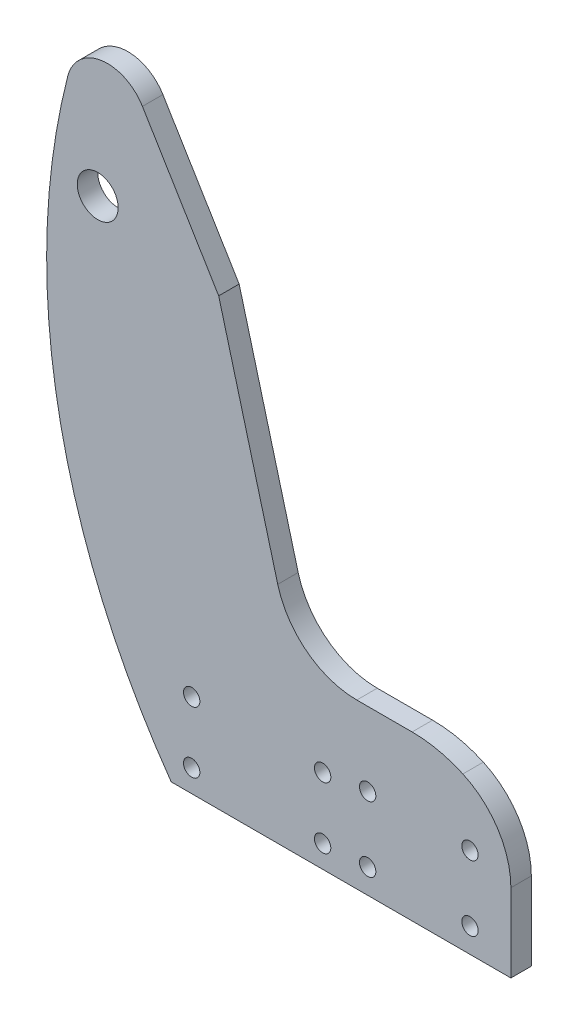
ISO-10303-21;
HEADER;
FILE_DESCRIPTION(('STEP AP214'),'2;1');
FILE_NAME('part.step','',(''),(''),'','','');
FILE_SCHEMA(('AUTOMOTIVE_DESIGN { 1 0 10303 214 1 1 1 1 }'));
ENDSEC;
DATA;
#1=APPLICATION_CONTEXT('core data for automotive mechanical design processes');
#2=APPLICATION_PROTOCOL_DEFINITION('international standard','automotive_design',2000,#1);
#3=PRODUCT_CONTEXT('',#1,'mechanical');
#4=PRODUCT('Part','Part','',(#3));
#5=PRODUCT_RELATED_PRODUCT_CATEGORY('part','',(#4));
#6=PRODUCT_DEFINITION_FORMATION('','',#4);
#7=PRODUCT_DEFINITION_CONTEXT('part definition',#1,'design');
#8=PRODUCT_DEFINITION('design','',#6,#7);
#9=PRODUCT_DEFINITION_SHAPE('','',#8);
#10=(LENGTH_UNIT() NAMED_UNIT(*) SI_UNIT(.MILLI.,.METRE.));
#11=(NAMED_UNIT(*) PLANE_ANGLE_UNIT() SI_UNIT($,.RADIAN.));
#12=(NAMED_UNIT(*) SI_UNIT($,.STERADIAN.) SOLID_ANGLE_UNIT());
#13=UNCERTAINTY_MEASURE_WITH_UNIT(LENGTH_MEASURE(1.E-05),#10,'distance_accuracy_value','');
#14=(GEOMETRIC_REPRESENTATION_CONTEXT(3) GLOBAL_UNCERTAINTY_ASSIGNED_CONTEXT((#13)) GLOBAL_UNIT_ASSIGNED_CONTEXT((#10,
#11,#12)) REPRESENTATION_CONTEXT('',''));
#15=CARTESIAN_POINT('',(0.,0.,0.));
#16=DIRECTION('',(0.,0.,1.));
#17=DIRECTION('',(1.,0.,0.));
#18=AXIS2_PLACEMENT_3D('',#15,#16,#17);
#19=CARTESIAN_POINT('',(41.5,-14.,5.));
#20=DIRECTION('',(0.,1.,0.));
#21=DIRECTION('',(-1.,0.,0.));
#22=AXIS2_PLACEMENT_3D('',#19,#20,#21);
#23=PLANE('',#22);
#24=DIRECTION('',(1.,0.,0.));
#25=VECTOR('',#24,1.);
#26=CARTESIAN_POINT('',(41.5,-14.,0.));
#27=LINE('',#26,#25);
#28=CARTESIAN_POINT('',(-41.5,-14.,0.));
#29=VERTEX_POINT('',#28);
#30=CARTESIAN_POINT('',(41.5,-14.,0.));
#31=VERTEX_POINT('',#30);
#32=EDGE_CURVE('E191',#29,#31,#27,.T.);
#33=ORIENTED_EDGE('',*,*,#32,.T.);
#34=DIRECTION('',(0.,0.,-1.));
#35=VECTOR('',#34,1.);
#36=CARTESIAN_POINT('',(41.5,-14.,5.));
#37=LINE('',#36,#35);
#38=CARTESIAN_POINT('',(41.5,-14.,5.));
#39=VERTEX_POINT('',#38);
#40=EDGE_CURVE('E202',#39,#31,#37,.T.);
#41=ORIENTED_EDGE('',*,*,#40,.F.);
#42=DIRECTION('',(1.,0.,0.));
#43=VECTOR('',#42,1.);
#44=CARTESIAN_POINT('',(41.5,-14.,5.));
#45=LINE('',#44,#43);
#46=CARTESIAN_POINT('',(-41.5,-14.,5.));
#47=VERTEX_POINT('',#46);
#48=EDGE_CURVE('E195',#47,#39,#45,.T.);
#49=ORIENTED_EDGE('',*,*,#48,.F.);
#50=DIRECTION('',(0.,0.,-1.));
#51=VECTOR('',#50,1.);
#52=CARTESIAN_POINT('',(-41.5,-14.,5.));
#53=LINE('',#52,#51);
#54=EDGE_CURVE('E140',#47,#29,#53,.T.);
#55=ORIENTED_EDGE('',*,*,#54,.T.);
#56=EDGE_LOOP('',(#33,#41,#49,#55));
#57=FACE_BOUND('',#56,.T.);
#58=ADVANCED_FACE('F38',(#57),#23,.F.);
#59=CARTESIAN_POINT('',(41.5,-14.,5.));
#60=DIRECTION('',(-1.,0.,0.));
#61=DIRECTION('',(0.,0.,1.));
#62=AXIS2_PLACEMENT_3D('',#59,#60,#61);
#63=PLANE('',#62);
#64=DIRECTION('',(0.,1.,0.));
#65=VECTOR('',#64,1.);
#66=CARTESIAN_POINT('',(41.5,-14.,0.));
#67=LINE('',#66,#65);
#68=CARTESIAN_POINT('',(41.5,5.10459657978891,0.));
#69=VERTEX_POINT('',#68);
#70=EDGE_CURVE('E199',#31,#69,#67,.T.);
#71=ORIENTED_EDGE('',*,*,#70,.T.);
#72=DIRECTION('',(0.,0.,-1.));
#73=VECTOR('',#72,1.);
#74=CARTESIAN_POINT('',(41.5,5.10459657978891,5.));
#75=LINE('',#74,#73);
#76=CARTESIAN_POINT('',(41.5,5.10459657978891,5.));
#77=VERTEX_POINT('',#76);
#78=EDGE_CURVE('E47',#69,#77,#75,.F.);
#79=ORIENTED_EDGE('',*,*,#78,.T.);
#80=DIRECTION('',(0.,1.,0.));
#81=VECTOR('',#80,1.);
#82=CARTESIAN_POINT('',(41.5,-14.,5.));
#83=LINE('',#82,#81);
#84=EDGE_CURVE('E198',#39,#77,#83,.T.);
#85=ORIENTED_EDGE('',*,*,#84,.F.);
#86=ORIENTED_EDGE('',*,*,#40,.T.);
#87=EDGE_LOOP('',(#71,#79,#85,#86));
#88=FACE_BOUND('',#87,.T.);
#89=ADVANCED_FACE('F308',(#88),#63,.F.);
#90=CARTESIAN_POINT('',(0.,0.,5.));
#91=DIRECTION('',(0.,0.,1.));
#92=DIRECTION('',(1.,0.,0.));
#93=AXIS2_PLACEMENT_3D('',#90,#91,#92);
#94=PLANE('',#93);
#95=CARTESIAN_POINT('',(-59.4554256864218,101.,5.));
#96=DIRECTION('',(0.,0.,1.));
#97=DIRECTION('',(1.,0.,0.));
#98=AXIS2_PLACEMENT_3D('',#95,#96,#97);
#99=CIRCLE('',#98,5.00000000000001);
#100=CARTESIAN_POINT('',(-54.4554256864218,101.,5.));
#101=VERTEX_POINT('',#100);
#102=EDGE_CURVE('E290',#101,#101,#99,.T.);
#103=ORIENTED_EDGE('',*,*,#102,.F.);
#104=EDGE_LOOP('',(#103));
#105=FACE_BOUND('',#104,.T.);
#106=ORIENTED_EDGE('',*,*,#84,.T.);
#107=CARTESIAN_POINT('',(21.5,5.10459657978891,5.));
#108=DIRECTION('',(0.,0.,1.));
#109=DIRECTION('',(1.,0.,0.));
#110=AXIS2_PLACEMENT_3D('',#107,#108,#109);
#111=CIRCLE('',#110,20.);
#112=CARTESIAN_POINT('',(29.7719577173233,23.3137897393667,5.));
#113=VERTEX_POINT('',#112);
#114=EDGE_CURVE('E11',#77,#113,#111,.T.);
#115=ORIENTED_EDGE('',*,*,#114,.T.);
#116=CARTESIAN_POINT('',(17.3640211413384,-4.00000000000001,5.));
#117=DIRECTION('',(0.,0.,1.));
#118=DIRECTION('',(1.,0.,0.));
#119=AXIS2_PLACEMENT_3D('',#116,#117,#118);
#120=CIRCLE('',#119,30.);
#121=CARTESIAN_POINT('',(17.3640211413384,26.,5.));
#122=VERTEX_POINT('',#121);
#123=EDGE_CURVE('E219',#113,#122,#120,.T.);
#124=ORIENTED_EDGE('',*,*,#123,.T.);
#125=DIRECTION('',(1.,0.,0.));
#126=VECTOR('',#125,1.);
#127=CARTESIAN_POINT('',(36.5,26.,5.));
#128=LINE('',#127,#126);
#129=CARTESIAN_POINT('',(3.84653975957914,26.,5.));
#130=VERTEX_POINT('',#129);
#131=EDGE_CURVE('E147',#130,#122,#128,.T.);
#132=ORIENTED_EDGE('',*,*,#131,.F.);
#133=CARTESIAN_POINT('',(3.84653975957914,46.,5.));
#134=DIRECTION('',(0.,0.,1.));
#135=DIRECTION('',(1.,0.,0.));
#136=AXIS2_PLACEMENT_3D('',#133,#134,#135);
#137=CIRCLE('',#136,20.);
#138=CARTESIAN_POINT('',(-15.4719767662022,40.8236190979495,5.));
#139=VERTEX_POINT('',#138);
#140=EDGE_CURVE('E145',#130,#139,#137,.F.);
#141=ORIENTED_EDGE('',*,*,#140,.T.);
#142=DIRECTION('',(0.258819045102525,-0.965925826289067,0.));
#143=VECTOR('',#142,1.);
#144=CARTESIAN_POINT('',(-35.6024699518307,115.951642448133,5.));
#145=LINE('',#144,#143);
#146=CARTESIAN_POINT('',(-29.8956633415499,94.6535502295955,5.));
#147=VERTEX_POINT('',#146);
#148=EDGE_CURVE('E134',#147,#139,#145,.T.);
#149=ORIENTED_EDGE('',*,*,#148,.F.);
#150=DIRECTION('',(0.517892214310959,-0.855445880436683,0.));
#151=VECTOR('',#150,1.);
#152=CARTESIAN_POINT('',(-59.7703085113104,144.,5.));
#153=LINE('',#152,#151);
#154=CARTESIAN_POINT('',(-48.5283103121514,125.430651433634,5.));
#155=VERTEX_POINT('',#154);
#156=EDGE_CURVE('E116',#155,#147,#153,.T.);
#157=ORIENTED_EDGE('',*,*,#156,.F.);
#158=CARTESIAN_POINT('',(-57.0827691165182,120.251729290525,5.));
#159=DIRECTION('',(0.,0.,1.));
#160=DIRECTION('',(1.,0.,0.));
#161=AXIS2_PLACEMENT_3D('',#158,#159,#160);
#162=CIRCLE('',#161,10.);
#163=CARTESIAN_POINT('',(-66.7711141485278,122.728818417047,5.));
#164=VERTEX_POINT('',#163);
#165=EDGE_CURVE('E243',#155,#164,#162,.T.);
#166=ORIENTED_EDGE('',*,*,#165,.T.);
#167=CARTESIAN_POINT('',(93.7264847033239,81.6932384872086,5.));
#168=DIRECTION('',(0.,0.,1.));
#169=DIRECTION('',(1.,0.,0.));
#170=AXIS2_PLACEMENT_3D('',#167,#168,#169);
#171=CIRCLE('',#170,165.660490333055);
#172=EDGE_CURVE('E284',#164,#47,#171,.T.);
#173=ORIENTED_EDGE('',*,*,#172,.T.);
#174=ORIENTED_EDGE('',*,*,#48,.T.);
#175=EDGE_LOOP('',(#106,#115,#124,#132,#141,#149,#157,#166,#173,#174));
#176=FACE_BOUND('',#175,.T.);
#177=CARTESIAN_POINT('',(-4.5,-8.50000000000001,5.));
#178=DIRECTION('',(0.,0.,1.));
#179=DIRECTION('',(1.,0.,0.));
#180=AXIS2_PLACEMENT_3D('',#177,#178,#179);
#181=CIRCLE('',#180,2.);
#182=CARTESIAN_POINT('',(-2.5,-8.50000000000001,5.));
#183=VERTEX_POINT('',#182);
#184=EDGE_CURVE('E277',#183,#183,#181,.T.);
#185=ORIENTED_EDGE('',*,*,#184,.F.);
#186=EDGE_LOOP('',(#185));
#187=FACE_BOUND('',#186,.T.);
#188=CARTESIAN_POINT('',(-4.5,6.49999999999999,5.));
#189=DIRECTION('',(0.,0.,1.));
#190=DIRECTION('',(1.,0.,0.));
#191=AXIS2_PLACEMENT_3D('',#188,#189,#190);
#192=CIRCLE('',#191,2.);
#193=CARTESIAN_POINT('',(-2.5,6.49999999999999,5.));
#194=VERTEX_POINT('',#193);
#195=EDGE_CURVE('E269',#194,#194,#192,.T.);
#196=ORIENTED_EDGE('',*,*,#195,.F.);
#197=EDGE_LOOP('',(#196));
#198=FACE_BOUND('',#197,.T.);
#199=CARTESIAN_POINT('',(-36.5,6.49999999999999,5.));
#200=DIRECTION('',(0.,0.,1.));
#201=DIRECTION('',(1.,0.,0.));
#202=AXIS2_PLACEMENT_3D('',#199,#200,#201);
#203=CIRCLE('',#202,2.);
#204=CARTESIAN_POINT('',(-34.5,6.49999999999999,5.));
#205=VERTEX_POINT('',#204);
#206=EDGE_CURVE('E260',#205,#205,#203,.T.);
#207=ORIENTED_EDGE('',*,*,#206,.F.);
#208=EDGE_LOOP('',(#207));
#209=FACE_BOUND('',#208,.T.);
#210=CARTESIAN_POINT('',(-36.5,-8.50000000000001,5.));
#211=DIRECTION('',(0.,0.,1.));
#212=DIRECTION('',(1.,0.,0.));
#213=AXIS2_PLACEMENT_3D('',#210,#211,#212);
#214=CIRCLE('',#213,2.);
#215=CARTESIAN_POINT('',(-34.5,-8.50000000000001,5.));
#216=VERTEX_POINT('',#215);
#217=EDGE_CURVE('E155',#216,#216,#214,.T.);
#218=ORIENTED_EDGE('',*,*,#217,.F.);
#219=EDGE_LOOP('',(#218));
#220=FACE_BOUND('',#219,.T.);
#221=CARTESIAN_POINT('',(31.5,8.,5.));
#222=DIRECTION('',(0.,0.,1.));
#223=DIRECTION('',(1.,0.,0.));
#224=AXIS2_PLACEMENT_3D('',#221,#222,#223);
#225=CIRCLE('',#224,2.);
#226=CARTESIAN_POINT('',(33.5,8.,5.));
#227=VERTEX_POINT('',#226);
#228=EDGE_CURVE('E168',#227,#227,#225,.T.);
#229=ORIENTED_EDGE('',*,*,#228,.F.);
#230=EDGE_LOOP('',(#229));
#231=FACE_BOUND('',#230,.T.);
#232=CARTESIAN_POINT('',(31.5,-8.00000000000001,5.));
#233=DIRECTION('',(0.,0.,1.));
#234=DIRECTION('',(1.,0.,0.));
#235=AXIS2_PLACEMENT_3D('',#232,#233,#234);
#236=CIRCLE('',#235,2.);
#237=CARTESIAN_POINT('',(33.5,-8.00000000000001,5.));
#238=VERTEX_POINT('',#237);
#239=EDGE_CURVE('E176',#238,#238,#236,.T.);
#240=ORIENTED_EDGE('',*,*,#239,.F.);
#241=EDGE_LOOP('',(#240));
#242=FACE_BOUND('',#241,.T.);
#243=CARTESIAN_POINT('',(6.5,-8.00000000000002,5.));
#244=DIRECTION('',(0.,0.,1.));
#245=DIRECTION('',(1.,0.,0.));
#246=AXIS2_PLACEMENT_3D('',#243,#244,#245);
#247=CIRCLE('',#246,2.);
#248=CARTESIAN_POINT('',(8.5,-8.00000000000002,5.));
#249=VERTEX_POINT('',#248);
#250=EDGE_CURVE('E127',#249,#249,#247,.T.);
#251=ORIENTED_EDGE('',*,*,#250,.F.);
#252=EDGE_LOOP('',(#251));
#253=FACE_BOUND('',#252,.T.);
#254=CARTESIAN_POINT('',(6.5,8.00000000000001,5.));
#255=DIRECTION('',(0.,0.,1.));
#256=DIRECTION('',(1.,0.,0.));
#257=AXIS2_PLACEMENT_3D('',#254,#255,#256);
#258=CIRCLE('',#257,2.);
#259=CARTESIAN_POINT('',(8.5,8.00000000000001,5.));
#260=VERTEX_POINT('',#259);
#261=EDGE_CURVE('E167',#260,#260,#258,.T.);
#262=ORIENTED_EDGE('',*,*,#261,.F.);
#263=EDGE_LOOP('',(#262));
#264=FACE_BOUND('',#263,.T.);
#265=ADVANCED_FACE('F142',(#105,#176,#187,#198,#209,#220,#231,#242,#253,#264),#94,.T.);
#266=CARTESIAN_POINT('',(0.,0.,0.));
#267=DIRECTION('',(0.,0.,1.));
#268=DIRECTION('',(1.,0.,0.));
#269=AXIS2_PLACEMENT_3D('',#266,#267,#268);
#270=PLANE('',#269);
#271=CARTESIAN_POINT('',(-59.4554256864218,101.,0.));
#272=DIRECTION('',(0.,0.,1.));
#273=DIRECTION('',(1.,0.,0.));
#274=AXIS2_PLACEMENT_3D('',#271,#272,#273);
#275=CIRCLE('',#274,5.00000000000001);
#276=CARTESIAN_POINT('',(-54.4554256864218,101.,0.));
#277=VERTEX_POINT('',#276);
#278=EDGE_CURVE('E287',#277,#277,#275,.T.);
#279=ORIENTED_EDGE('',*,*,#278,.T.);
#280=EDGE_LOOP('',(#279));
#281=FACE_BOUND('',#280,.T.);
#282=CARTESIAN_POINT('',(17.3640211413384,-4.00000000000001,0.));
#283=DIRECTION('',(0.,0.,1.));
#284=DIRECTION('',(1.,0.,0.));
#285=AXIS2_PLACEMENT_3D('',#282,#283,#284);
#286=CIRCLE('',#285,30.);
#287=CARTESIAN_POINT('',(17.3640211413384,26.,0.));
#288=VERTEX_POINT('',#287);
#289=CARTESIAN_POINT('',(29.7719577173233,23.3137897393667,0.));
#290=VERTEX_POINT('',#289);
#291=EDGE_CURVE('E216',#288,#290,#286,.F.);
#292=ORIENTED_EDGE('',*,*,#291,.T.);
#293=CARTESIAN_POINT('',(21.5,5.10459657978891,0.));
#294=DIRECTION('',(0.,0.,1.));
#295=DIRECTION('',(1.,0.,0.));
#296=AXIS2_PLACEMENT_3D('',#293,#294,#295);
#297=CIRCLE('',#296,20.);
#298=EDGE_CURVE('E61',#290,#69,#297,.F.);
#299=ORIENTED_EDGE('',*,*,#298,.T.);
#300=ORIENTED_EDGE('',*,*,#70,.F.);
#301=ORIENTED_EDGE('',*,*,#32,.F.);
#302=CARTESIAN_POINT('',(93.7264847033239,81.6932384872086,0.));
#303=DIRECTION('',(0.,0.,1.));
#304=DIRECTION('',(1.,0.,0.));
#305=AXIS2_PLACEMENT_3D('',#302,#303,#304);
#306=CIRCLE('',#305,165.660490333055);
#307=CARTESIAN_POINT('',(-66.7711141485278,122.728818417047,0.));
#308=VERTEX_POINT('',#307);
#309=EDGE_CURVE('E265',#308,#29,#306,.T.);
#310=ORIENTED_EDGE('',*,*,#309,.F.);
#311=CARTESIAN_POINT('',(-57.0827691165182,120.251729290525,0.));
#312=DIRECTION('',(0.,0.,1.));
#313=DIRECTION('',(1.,0.,0.));
#314=AXIS2_PLACEMENT_3D('',#311,#312,#313);
#315=CIRCLE('',#314,10.);
#316=CARTESIAN_POINT('',(-48.5283103121514,125.430651433634,0.));
#317=VERTEX_POINT('',#316);
#318=EDGE_CURVE('E238',#308,#317,#315,.F.);
#319=ORIENTED_EDGE('',*,*,#318,.T.);
#320=DIRECTION('',(0.517892214310959,-0.855445880436683,0.));
#321=VECTOR('',#320,1.);
#322=CARTESIAN_POINT('',(-59.7703085113104,144.,0.));
#323=LINE('',#322,#321);
#324=CARTESIAN_POINT('',(-29.8956633415499,94.6535502295955,0.));
#325=VERTEX_POINT('',#324);
#326=EDGE_CURVE('E128',#317,#325,#323,.T.);
#327=ORIENTED_EDGE('',*,*,#326,.T.);
#328=DIRECTION('',(0.258819045102525,-0.965925826289067,0.));
#329=VECTOR('',#328,1.);
#330=CARTESIAN_POINT('',(-35.6024699518307,115.951642448133,0.));
#331=LINE('',#330,#329);
#332=CARTESIAN_POINT('',(-15.4719767662022,40.8236190979495,0.));
#333=VERTEX_POINT('',#332);
#334=EDGE_CURVE('E137',#325,#333,#331,.T.);
#335=ORIENTED_EDGE('',*,*,#334,.T.);
#336=CARTESIAN_POINT('',(3.84653975957914,46.,0.));
#337=DIRECTION('',(0.,0.,1.));
#338=DIRECTION('',(1.,0.,0.));
#339=AXIS2_PLACEMENT_3D('',#336,#337,#338);
#340=CIRCLE('',#339,20.);
#341=CARTESIAN_POINT('',(3.84653975957914,26.,0.));
#342=VERTEX_POINT('',#341);
#343=EDGE_CURVE('E231',#333,#342,#340,.T.);
#344=ORIENTED_EDGE('',*,*,#343,.T.);
#345=DIRECTION('',(1.,0.,0.));
#346=VECTOR('',#345,1.);
#347=CARTESIAN_POINT('',(36.5,26.,0.));
#348=LINE('',#347,#346);
#349=EDGE_CURVE('E158',#342,#288,#348,.T.);
#350=ORIENTED_EDGE('',*,*,#349,.T.);
#351=EDGE_LOOP('',(#292,#299,#300,#301,#310,#319,#327,#335,#344,#350));
#352=FACE_BOUND('',#351,.T.);
#353=CARTESIAN_POINT('',(-4.5,-8.50000000000001,0.));
#354=DIRECTION('',(0.,0.,1.));
#355=DIRECTION('',(1.,0.,0.));
#356=AXIS2_PLACEMENT_3D('',#353,#354,#355);
#357=CIRCLE('',#356,2.);
#358=CARTESIAN_POINT('',(-2.5,-8.50000000000001,0.));
#359=VERTEX_POINT('',#358);
#360=EDGE_CURVE('E258',#359,#359,#357,.T.);
#361=ORIENTED_EDGE('',*,*,#360,.T.);
#362=EDGE_LOOP('',(#361));
#363=FACE_BOUND('',#362,.T.);
#364=CARTESIAN_POINT('',(-4.5,6.49999999999999,0.));
#365=DIRECTION('',(0.,0.,1.));
#366=DIRECTION('',(1.,0.,0.));
#367=AXIS2_PLACEMENT_3D('',#364,#365,#366);
#368=CIRCLE('',#367,2.);
#369=CARTESIAN_POINT('',(-2.5,6.49999999999999,0.));
#370=VERTEX_POINT('',#369);
#371=EDGE_CURVE('E273',#370,#370,#368,.T.);
#372=ORIENTED_EDGE('',*,*,#371,.T.);
#373=EDGE_LOOP('',(#372));
#374=FACE_BOUND('',#373,.T.);
#375=CARTESIAN_POINT('',(-36.5,6.49999999999999,0.));
#376=DIRECTION('',(0.,0.,1.));
#377=DIRECTION('',(1.,0.,0.));
#378=AXIS2_PLACEMENT_3D('',#375,#376,#377);
#379=CIRCLE('',#378,2.);
#380=CARTESIAN_POINT('',(-34.5,6.49999999999999,0.));
#381=VERTEX_POINT('',#380);
#382=EDGE_CURVE('E264',#381,#381,#379,.T.);
#383=ORIENTED_EDGE('',*,*,#382,.T.);
#384=EDGE_LOOP('',(#383));
#385=FACE_BOUND('',#384,.T.);
#386=CARTESIAN_POINT('',(-36.5,-8.50000000000001,0.));
#387=DIRECTION('',(0.,0.,1.));
#388=DIRECTION('',(1.,0.,0.));
#389=AXIS2_PLACEMENT_3D('',#386,#387,#388);
#390=CIRCLE('',#389,2.);
#391=CARTESIAN_POINT('',(-34.5,-8.50000000000001,0.));
#392=VERTEX_POINT('',#391);
#393=EDGE_CURVE('E148',#392,#392,#390,.T.);
#394=ORIENTED_EDGE('',*,*,#393,.T.);
#395=EDGE_LOOP('',(#394));
#396=FACE_BOUND('',#395,.T.);
#397=CARTESIAN_POINT('',(31.5,8.,0.));
#398=DIRECTION('',(0.,0.,1.));
#399=DIRECTION('',(1.,0.,0.));
#400=AXIS2_PLACEMENT_3D('',#397,#398,#399);
#401=CIRCLE('',#400,2.);
#402=CARTESIAN_POINT('',(33.5,8.,0.));
#403=VERTEX_POINT('',#402);
#404=EDGE_CURVE('E163',#403,#403,#401,.T.);
#405=ORIENTED_EDGE('',*,*,#404,.T.);
#406=EDGE_LOOP('',(#405));
#407=FACE_BOUND('',#406,.T.);
#408=CARTESIAN_POINT('',(31.5,-8.00000000000001,0.));
#409=DIRECTION('',(0.,0.,1.));
#410=DIRECTION('',(1.,0.,0.));
#411=AXIS2_PLACEMENT_3D('',#408,#409,#410);
#412=CIRCLE('',#411,2.);
#413=CARTESIAN_POINT('',(33.5,-8.00000000000001,0.));
#414=VERTEX_POINT('',#413);
#415=EDGE_CURVE('E172',#414,#414,#412,.T.);
#416=ORIENTED_EDGE('',*,*,#415,.T.);
#417=EDGE_LOOP('',(#416));
#418=FACE_BOUND('',#417,.T.);
#419=CARTESIAN_POINT('',(6.5,-8.00000000000002,0.));
#420=DIRECTION('',(0.,0.,1.));
#421=DIRECTION('',(1.,0.,0.));
#422=AXIS2_PLACEMENT_3D('',#419,#420,#421);
#423=CIRCLE('',#422,2.);
#424=CARTESIAN_POINT('',(8.5,-8.00000000000002,0.));
#425=VERTEX_POINT('',#424);
#426=EDGE_CURVE('E180',#425,#425,#423,.T.);
#427=ORIENTED_EDGE('',*,*,#426,.T.);
#428=EDGE_LOOP('',(#427));
#429=FACE_BOUND('',#428,.T.);
#430=CARTESIAN_POINT('',(6.5,8.00000000000001,0.));
#431=DIRECTION('',(0.,0.,1.));
#432=DIRECTION('',(1.,0.,0.));
#433=AXIS2_PLACEMENT_3D('',#430,#431,#432);
#434=CIRCLE('',#433,2.);
#435=CARTESIAN_POINT('',(8.5,8.00000000000001,0.));
#436=VERTEX_POINT('',#435);
#437=EDGE_CURVE('E187',#436,#436,#434,.T.);
#438=ORIENTED_EDGE('',*,*,#437,.T.);
#439=EDGE_LOOP('',(#438));
#440=FACE_BOUND('',#439,.T.);
#441=ADVANCED_FACE('F298',(#281,#352,#363,#374,#385,#396,#407,#418,#429,#440),#270,.F.);
#442=CARTESIAN_POINT('',(6.5,8.00000000000001,0.));
#443=DIRECTION('',(0.,0.,1.));
#444=DIRECTION('',(1.,0.,0.));
#445=AXIS2_PLACEMENT_3D('',#442,#443,#444);
#446=CYLINDRICAL_SURFACE('',#445,2.);
#447=ORIENTED_EDGE('',*,*,#437,.F.);
#448=EDGE_LOOP('',(#447));
#449=FACE_BOUND('',#448,.T.);
#450=ORIENTED_EDGE('',*,*,#261,.T.);
#451=EDGE_LOOP('',(#450));
#452=FACE_BOUND('',#451,.T.);
#453=ADVANCED_FACE('F314',(#449,#452),#446,.F.);
#454=CARTESIAN_POINT('',(6.5,-8.00000000000002,0.));
#455=DIRECTION('',(0.,0.,1.));
#456=DIRECTION('',(1.,0.,0.));
#457=AXIS2_PLACEMENT_3D('',#454,#455,#456);
#458=CYLINDRICAL_SURFACE('',#457,2.);
#459=ORIENTED_EDGE('',*,*,#426,.F.);
#460=EDGE_LOOP('',(#459));
#461=FACE_BOUND('',#460,.T.);
#462=ORIENTED_EDGE('',*,*,#250,.T.);
#463=EDGE_LOOP('',(#462));
#464=FACE_BOUND('',#463,.T.);
#465=ADVANCED_FACE('F378',(#461,#464),#458,.F.);
#466=CARTESIAN_POINT('',(31.5,-8.00000000000001,0.));
#467=DIRECTION('',(0.,0.,1.));
#468=DIRECTION('',(1.,0.,0.));
#469=AXIS2_PLACEMENT_3D('',#466,#467,#468);
#470=CYLINDRICAL_SURFACE('',#469,2.);
#471=ORIENTED_EDGE('',*,*,#415,.F.);
#472=EDGE_LOOP('',(#471));
#473=FACE_BOUND('',#472,.T.);
#474=ORIENTED_EDGE('',*,*,#239,.T.);
#475=EDGE_LOOP('',(#474));
#476=FACE_BOUND('',#475,.T.);
#477=ADVANCED_FACE('F374',(#473,#476),#470,.F.);
#478=CARTESIAN_POINT('',(31.5,8.,0.));
#479=DIRECTION('',(0.,0.,1.));
#480=DIRECTION('',(1.,0.,0.));
#481=AXIS2_PLACEMENT_3D('',#478,#479,#480);
#482=CYLINDRICAL_SURFACE('',#481,2.);
#483=ORIENTED_EDGE('',*,*,#404,.F.);
#484=EDGE_LOOP('',(#483));
#485=FACE_BOUND('',#484,.T.);
#486=ORIENTED_EDGE('',*,*,#228,.T.);
#487=EDGE_LOOP('',(#486));
#488=FACE_BOUND('',#487,.T.);
#489=ADVANCED_FACE('F367',(#485,#488),#482,.F.);
#490=CARTESIAN_POINT('',(-59.7703085113104,144.,5.));
#491=DIRECTION('',(0.855445880436683,0.517892214310959,0.));
#492=DIRECTION('',(-0.517892214310959,0.855445880436683,0.));
#493=AXIS2_PLACEMENT_3D('',#490,#491,#492);
#494=PLANE('',#493);
#495=ORIENTED_EDGE('',*,*,#326,.F.);
#496=DIRECTION('',(0.,0.,1.));
#497=VECTOR('',#496,1.);
#498=CARTESIAN_POINT('',(-48.5283103121514,125.430651433634,5.));
#499=LINE('',#498,#497);
#500=EDGE_CURVE('E122',#317,#155,#499,.T.);
#501=ORIENTED_EDGE('',*,*,#500,.T.);
#502=ORIENTED_EDGE('',*,*,#156,.T.);
#503=DIRECTION('',(0.,0.,1.));
#504=VECTOR('',#503,1.);
#505=CARTESIAN_POINT('',(-29.89566334155,94.6535502295957,5.));
#506=LINE('',#505,#504);
#507=EDGE_CURVE('E120',#325,#147,#506,.T.);
#508=ORIENTED_EDGE('',*,*,#507,.F.);
#509=EDGE_LOOP('',(#495,#501,#502,#508));
#510=FACE_BOUND('',#509,.T.);
#511=ADVANCED_FACE('F119',(#510),#494,.T.);
#512=CARTESIAN_POINT('',(36.5,26.,0.));
#513=DIRECTION('',(0.,-1.,0.));
#514=DIRECTION('',(1.,0.,0.));
#515=AXIS2_PLACEMENT_3D('',#512,#513,#514);
#516=PLANE('',#515);
#517=ORIENTED_EDGE('',*,*,#349,.F.);
#518=DIRECTION('',(0.,0.,1.));
#519=VECTOR('',#518,1.);
#520=CARTESIAN_POINT('',(3.84653975957914,26.,5.));
#521=LINE('',#520,#519);
#522=EDGE_CURVE('E222',#342,#130,#521,.T.);
#523=ORIENTED_EDGE('',*,*,#522,.T.);
#524=ORIENTED_EDGE('',*,*,#131,.T.);
#525=DIRECTION('',(0.,0.,-1.));
#526=VECTOR('',#525,1.);
#527=CARTESIAN_POINT('',(17.3640211413384,26.,0.));
#528=LINE('',#527,#526);
#529=EDGE_CURVE('E139',#122,#288,#528,.T.);
#530=ORIENTED_EDGE('',*,*,#529,.T.);
#531=EDGE_LOOP('',(#517,#523,#524,#530));
#532=FACE_BOUND('',#531,.T.);
#533=ADVANCED_FACE('F359',(#532),#516,.F.);
#534=CARTESIAN_POINT('',(-35.6024699518307,115.951642448133,0.));
#535=DIRECTION('',(-0.965925826289067,-0.258819045102525,0.));
#536=DIRECTION('',(0.258819045102525,-0.965925826289067,0.));
#537=AXIS2_PLACEMENT_3D('',#534,#535,#536);
#538=PLANE('',#537);
#539=ORIENTED_EDGE('',*,*,#148,.T.);
#540=DIRECTION('',(0.,0.,1.));
#541=VECTOR('',#540,1.);
#542=CARTESIAN_POINT('',(-15.4719767662022,40.8236190979495,0.));
#543=LINE('',#542,#541);
#544=EDGE_CURVE('E226',#139,#333,#543,.F.);
#545=ORIENTED_EDGE('',*,*,#544,.T.);
#546=ORIENTED_EDGE('',*,*,#334,.F.);
#547=ORIENTED_EDGE('',*,*,#507,.T.);
#548=EDGE_LOOP('',(#539,#545,#546,#547));
#549=FACE_BOUND('',#548,.T.);
#550=ADVANCED_FACE('F133',(#549),#538,.F.);
#551=CARTESIAN_POINT('',(17.3640211413384,-4.00000000000001,0.));
#552=DIRECTION('',(0.,0.,1.));
#553=DIRECTION('',(1.,0.,0.));
#554=AXIS2_PLACEMENT_3D('',#551,#552,#553);
#555=CYLINDRICAL_SURFACE('',#554,30.);
#556=ORIENTED_EDGE('',*,*,#123,.F.);
#557=DIRECTION('',(0.,0.,1.));
#558=VECTOR('',#557,1.);
#559=CARTESIAN_POINT('',(29.7719577173233,23.3137897393667,0.));
#560=LINE('',#559,#558);
#561=EDGE_CURVE('E246',#113,#290,#560,.F.);
#562=ORIENTED_EDGE('',*,*,#561,.T.);
#563=ORIENTED_EDGE('',*,*,#291,.F.);
#564=ORIENTED_EDGE('',*,*,#529,.F.);
#565=EDGE_LOOP('',(#556,#562,#563,#564));
#566=FACE_BOUND('',#565,.T.);
#567=ADVANCED_FACE('F325',(#566),#555,.T.);
#568=CARTESIAN_POINT('',(3.84653975957914,46.,0.));
#569=DIRECTION('',(0.,0.,-1.));
#570=DIRECTION('',(-1.,0.,0.));
#571=AXIS2_PLACEMENT_3D('',#568,#569,#570);
#572=CYLINDRICAL_SURFACE('',#571,20.);
#573=ORIENTED_EDGE('',*,*,#343,.F.);
#574=ORIENTED_EDGE('',*,*,#544,.F.);
#575=ORIENTED_EDGE('',*,*,#140,.F.);
#576=ORIENTED_EDGE('',*,*,#522,.F.);
#577=EDGE_LOOP('',(#573,#574,#575,#576));
#578=FACE_BOUND('',#577,.T.);
#579=ADVANCED_FACE('F328',(#578),#572,.F.);
#580=CARTESIAN_POINT('',(-36.5,-8.50000000000001,0.));
#581=DIRECTION('',(0.,0.,1.));
#582=DIRECTION('',(1.,0.,0.));
#583=AXIS2_PLACEMENT_3D('',#580,#581,#582);
#584=CYLINDRICAL_SURFACE('',#583,2.);
#585=ORIENTED_EDGE('',*,*,#393,.F.);
#586=EDGE_LOOP('',(#585));
#587=FACE_BOUND('',#586,.T.);
#588=ORIENTED_EDGE('',*,*,#217,.T.);
#589=EDGE_LOOP('',(#588));
#590=FACE_BOUND('',#589,.T.);
#591=ADVANCED_FACE('F331',(#587,#590),#584,.F.);
#592=CARTESIAN_POINT('',(-36.5,6.49999999999999,0.));
#593=DIRECTION('',(0.,0.,1.));
#594=DIRECTION('',(1.,0.,0.));
#595=AXIS2_PLACEMENT_3D('',#592,#593,#594);
#596=CYLINDRICAL_SURFACE('',#595,2.);
#597=ORIENTED_EDGE('',*,*,#382,.F.);
#598=EDGE_LOOP('',(#597));
#599=FACE_BOUND('',#598,.T.);
#600=ORIENTED_EDGE('',*,*,#206,.T.);
#601=EDGE_LOOP('',(#600));
#602=FACE_BOUND('',#601,.T.);
#603=ADVANCED_FACE('F481',(#599,#602),#596,.F.);
#604=CARTESIAN_POINT('',(-4.5,6.49999999999999,0.));
#605=DIRECTION('',(0.,0.,1.));
#606=DIRECTION('',(1.,0.,0.));
#607=AXIS2_PLACEMENT_3D('',#604,#605,#606);
#608=CYLINDRICAL_SURFACE('',#607,2.);
#609=ORIENTED_EDGE('',*,*,#371,.F.);
#610=EDGE_LOOP('',(#609));
#611=FACE_BOUND('',#610,.T.);
#612=ORIENTED_EDGE('',*,*,#195,.T.);
#613=EDGE_LOOP('',(#612));
#614=FACE_BOUND('',#613,.T.);
#615=ADVANCED_FACE('F472',(#611,#614),#608,.F.);
#616=CARTESIAN_POINT('',(-4.5,-8.50000000000001,0.));
#617=DIRECTION('',(0.,0.,1.));
#618=DIRECTION('',(1.,0.,0.));
#619=AXIS2_PLACEMENT_3D('',#616,#617,#618);
#620=CYLINDRICAL_SURFACE('',#619,2.);
#621=ORIENTED_EDGE('',*,*,#360,.F.);
#622=EDGE_LOOP('',(#621));
#623=FACE_BOUND('',#622,.T.);
#624=ORIENTED_EDGE('',*,*,#184,.T.);
#625=EDGE_LOOP('',(#624));
#626=FACE_BOUND('',#625,.T.);
#627=ADVANCED_FACE('F339',(#623,#626),#620,.F.);
#628=CARTESIAN_POINT('',(93.7264847033239,81.6932384872086,0.));
#629=DIRECTION('',(0.,0.,1.));
#630=DIRECTION('',(1.,0.,0.));
#631=AXIS2_PLACEMENT_3D('',#628,#629,#630);
#632=CYLINDRICAL_SURFACE('',#631,165.660490333055);
#633=ORIENTED_EDGE('',*,*,#172,.F.);
#634=DIRECTION('',(0.,0.,1.));
#635=VECTOR('',#634,1.);
#636=CARTESIAN_POINT('',(-66.7711141485278,122.728818417047,0.));
#637=LINE('',#636,#635);
#638=EDGE_CURVE('E234',#164,#308,#637,.F.);
#639=ORIENTED_EDGE('',*,*,#638,.T.);
#640=ORIENTED_EDGE('',*,*,#309,.T.);
#641=ORIENTED_EDGE('',*,*,#54,.F.);
#642=EDGE_LOOP('',(#633,#639,#640,#641));
#643=FACE_BOUND('',#642,.T.);
#644=ADVANCED_FACE('F334',(#643),#632,.T.);
#645=CARTESIAN_POINT('',(-57.0827691165182,120.251729290525,0.));
#646=DIRECTION('',(0.,0.,1.));
#647=DIRECTION('',(1.,0.,0.));
#648=AXIS2_PLACEMENT_3D('',#645,#646,#647);
#649=CYLINDRICAL_SURFACE('',#648,10.);
#650=ORIENTED_EDGE('',*,*,#165,.F.);
#651=ORIENTED_EDGE('',*,*,#500,.F.);
#652=ORIENTED_EDGE('',*,*,#318,.F.);
#653=ORIENTED_EDGE('',*,*,#638,.F.);
#654=EDGE_LOOP('',(#650,#651,#652,#653));
#655=FACE_BOUND('',#654,.T.);
#656=ADVANCED_FACE('F303',(#655),#649,.T.);
#657=CARTESIAN_POINT('',(-59.4554256864218,101.,0.));
#658=DIRECTION('',(0.,0.,1.));
#659=DIRECTION('',(1.,0.,0.));
#660=AXIS2_PLACEMENT_3D('',#657,#658,#659);
#661=CYLINDRICAL_SURFACE('',#660,5.00000000000001);
#662=ORIENTED_EDGE('',*,*,#278,.F.);
#663=EDGE_LOOP('',(#662));
#664=FACE_BOUND('',#663,.T.);
#665=ORIENTED_EDGE('',*,*,#102,.T.);
#666=EDGE_LOOP('',(#665));
#667=FACE_BOUND('',#666,.T.);
#668=ADVANCED_FACE('F300',(#664,#667),#661,.F.);
#669=CARTESIAN_POINT('',(21.5,5.10459657978891,0.));
#670=DIRECTION('',(0.,0.,1.));
#671=DIRECTION('',(1.,0.,0.));
#672=AXIS2_PLACEMENT_3D('',#669,#670,#671);
#673=CYLINDRICAL_SURFACE('',#672,20.);
#674=ORIENTED_EDGE('',*,*,#114,.F.);
#675=ORIENTED_EDGE('',*,*,#78,.F.);
#676=ORIENTED_EDGE('',*,*,#298,.F.);
#677=ORIENTED_EDGE('',*,*,#561,.F.);
#678=EDGE_LOOP('',(#674,#675,#676,#677));
#679=FACE_BOUND('',#678,.T.);
#680=ADVANCED_FACE('F40',(#679),#673,.T.);
#681=CLOSED_SHELL('',(#58,#89,#265,#441,#453,#465,#477,#489,#511,#533,#550,#567,#579,#591,#603,
#615,#627,#644,#656,#668,#680));
#682=MANIFOLD_SOLID_BREP('B2',#681);
#683=ADVANCED_BREP_SHAPE_REPRESENTATION('',(#18,#682),#14);
#684=SHAPE_DEFINITION_REPRESENTATION(#9,#683);
ENDSEC;
END-ISO-10303-21;
